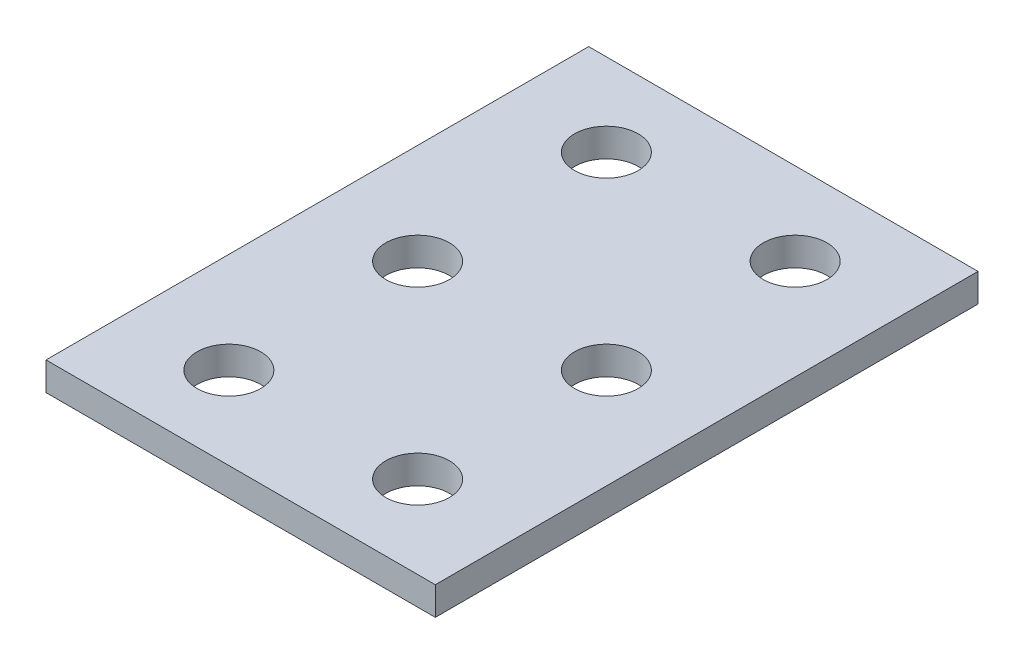
ISO-10303-21;
HEADER;
FILE_DESCRIPTION(('STEP AP214'),'2;1');
FILE_NAME('part.step','',(''),(''),'','','');
FILE_SCHEMA(('AUTOMOTIVE_DESIGN { 1 0 10303 214 1 1 1 1 }'));
ENDSEC;
DATA;
#1=APPLICATION_CONTEXT('core data for automotive mechanical design processes');
#2=APPLICATION_PROTOCOL_DEFINITION('international standard','automotive_design',2000,#1);
#3=PRODUCT_CONTEXT('',#1,'mechanical');
#4=PRODUCT('Part','Part','',(#3));
#5=PRODUCT_RELATED_PRODUCT_CATEGORY('part','',(#4));
#6=PRODUCT_DEFINITION_FORMATION('','',#4);
#7=PRODUCT_DEFINITION_CONTEXT('part definition',#1,'design');
#8=PRODUCT_DEFINITION('design','',#6,#7);
#9=PRODUCT_DEFINITION_SHAPE('','',#8);
#10=(LENGTH_UNIT() NAMED_UNIT(*) SI_UNIT(.MILLI.,.METRE.));
#11=(NAMED_UNIT(*) PLANE_ANGLE_UNIT() SI_UNIT($,.RADIAN.));
#12=(NAMED_UNIT(*) SI_UNIT($,.STERADIAN.) SOLID_ANGLE_UNIT());
#13=UNCERTAINTY_MEASURE_WITH_UNIT(LENGTH_MEASURE(1.E-05),#10,'distance_accuracy_value','');
#14=(GEOMETRIC_REPRESENTATION_CONTEXT(3) GLOBAL_UNCERTAINTY_ASSIGNED_CONTEXT((#13)) GLOBAL_UNIT_ASSIGNED_CONTEXT((#10,
#11,#12)) REPRESENTATION_CONTEXT('',''));
#15=CARTESIAN_POINT('',(0.,0.,0.));
#16=DIRECTION('',(0.,0.,1.));
#17=DIRECTION('',(1.,0.,0.));
#18=AXIS2_PLACEMENT_3D('',#15,#16,#17);
#19=CARTESIAN_POINT('',(0.,12.,0.));
#20=DIRECTION('',(1.,0.,0.));
#21=DIRECTION('',(0.,0.,-1.));
#22=AXIS2_PLACEMENT_3D('',#19,#20,#21);
#23=PLANE('',#22);
#24=DIRECTION('',(0.,0.,1.));
#25=VECTOR('',#24,1.);
#26=CARTESIAN_POINT('',(0.,0.,0.));
#27=LINE('',#26,#25);
#28=CARTESIAN_POINT('',(0.,0.,-230.));
#29=VERTEX_POINT('',#28);
#30=CARTESIAN_POINT('',(0.,0.,0.));
#31=VERTEX_POINT('',#30);
#32=EDGE_CURVE('E97',#29,#31,#27,.T.);
#33=ORIENTED_EDGE('',*,*,#32,.T.);
#34=DIRECTION('',(0.,-1.,0.));
#35=VECTOR('',#34,1.);
#36=CARTESIAN_POINT('',(0.,12.,0.));
#37=LINE('',#36,#35);
#38=CARTESIAN_POINT('',(0.,12.,0.));
#39=VERTEX_POINT('',#38);
#40=EDGE_CURVE('E11',#39,#31,#37,.T.);
#41=ORIENTED_EDGE('',*,*,#40,.F.);
#42=DIRECTION('',(0.,0.,1.));
#43=VECTOR('',#42,1.);
#44=CARTESIAN_POINT('',(0.,12.,0.));
#45=LINE('',#44,#43);
#46=CARTESIAN_POINT('',(0.,12.,-230.));
#47=VERTEX_POINT('',#46);
#48=EDGE_CURVE('E85',#47,#39,#45,.T.);
#49=ORIENTED_EDGE('',*,*,#48,.F.);
#50=DIRECTION('',(0.,-1.,0.));
#51=VECTOR('',#50,1.);
#52=CARTESIAN_POINT('',(0.,12.,-230.));
#53=LINE('',#52,#51);
#54=EDGE_CURVE('E93',#47,#29,#53,.T.);
#55=ORIENTED_EDGE('',*,*,#54,.T.);
#56=EDGE_LOOP('',(#33,#41,#49,#55));
#57=FACE_BOUND('',#56,.T.);
#58=ADVANCED_FACE('F34',(#57),#23,.F.);
#59=CARTESIAN_POINT('',(0.,12.,0.));
#60=DIRECTION('',(0.,0.,-1.));
#61=DIRECTION('',(-1.,0.,0.));
#62=AXIS2_PLACEMENT_3D('',#59,#60,#61);
#63=PLANE('',#62);
#64=DIRECTION('',(1.,0.,0.));
#65=VECTOR('',#64,1.);
#66=CARTESIAN_POINT('',(0.,0.,0.));
#67=LINE('',#66,#65);
#68=CARTESIAN_POINT('',(165.,0.,0.));
#69=VERTEX_POINT('',#68);
#70=EDGE_CURVE('E89',#31,#69,#67,.T.);
#71=ORIENTED_EDGE('',*,*,#70,.T.);
#72=DIRECTION('',(0.,-1.,0.));
#73=VECTOR('',#72,1.);
#74=CARTESIAN_POINT('',(165.,12.,0.));
#75=LINE('',#74,#73);
#76=CARTESIAN_POINT('',(165.,12.,0.));
#77=VERTEX_POINT('',#76);
#78=EDGE_CURVE('E42',#77,#69,#75,.T.);
#79=ORIENTED_EDGE('',*,*,#78,.F.);
#80=DIRECTION('',(1.,0.,0.));
#81=VECTOR('',#80,1.);
#82=CARTESIAN_POINT('',(0.,12.,0.));
#83=LINE('',#82,#81);
#84=EDGE_CURVE('E80',#39,#77,#83,.T.);
#85=ORIENTED_EDGE('',*,*,#84,.F.);
#86=ORIENTED_EDGE('',*,*,#40,.T.);
#87=EDGE_LOOP('',(#71,#79,#85,#86));
#88=FACE_BOUND('',#87,.T.);
#89=ADVANCED_FACE('F88',(#88),#63,.F.);
#90=CARTESIAN_POINT('',(165.,12.,0.));
#91=DIRECTION('',(-1.,0.,0.));
#92=DIRECTION('',(0.,0.,1.));
#93=AXIS2_PLACEMENT_3D('',#90,#91,#92);
#94=PLANE('',#93);
#95=DIRECTION('',(0.,0.,-1.));
#96=VECTOR('',#95,1.);
#97=CARTESIAN_POINT('',(165.,0.,0.));
#98=LINE('',#97,#96);
#99=CARTESIAN_POINT('',(165.,0.,-230.));
#100=VERTEX_POINT('',#99);
#101=EDGE_CURVE('E67',#69,#100,#98,.T.);
#102=ORIENTED_EDGE('',*,*,#101,.T.);
#103=DIRECTION('',(0.,-1.,0.));
#104=VECTOR('',#103,1.);
#105=CARTESIAN_POINT('',(165.,12.,-230.));
#106=LINE('',#105,#104);
#107=CARTESIAN_POINT('',(165.,12.,-230.));
#108=VERTEX_POINT('',#107);
#109=EDGE_CURVE('E90',#108,#100,#106,.T.);
#110=ORIENTED_EDGE('',*,*,#109,.F.);
#111=DIRECTION('',(0.,0.,-1.));
#112=VECTOR('',#111,1.);
#113=CARTESIAN_POINT('',(165.,12.,0.));
#114=LINE('',#113,#112);
#115=EDGE_CURVE('E83',#77,#108,#114,.T.);
#116=ORIENTED_EDGE('',*,*,#115,.F.);
#117=ORIENTED_EDGE('',*,*,#78,.T.);
#118=EDGE_LOOP('',(#102,#110,#116,#117));
#119=FACE_BOUND('',#118,.T.);
#120=ADVANCED_FACE('F91',(#119),#94,.F.);
#121=CARTESIAN_POINT('',(0.,12.,-230.));
#122=DIRECTION('',(0.,0.,1.));
#123=DIRECTION('',(1.,0.,0.));
#124=AXIS2_PLACEMENT_3D('',#121,#122,#123);
#125=PLANE('',#124);
#126=DIRECTION('',(-1.,0.,0.));
#127=VECTOR('',#126,1.);
#128=CARTESIAN_POINT('',(0.,0.,-230.));
#129=LINE('',#128,#127);
#130=EDGE_CURVE('E73',#100,#29,#129,.T.);
#131=ORIENTED_EDGE('',*,*,#130,.T.);
#132=ORIENTED_EDGE('',*,*,#54,.F.);
#133=DIRECTION('',(-1.,0.,0.));
#134=VECTOR('',#133,1.);
#135=CARTESIAN_POINT('',(0.,12.,-230.));
#136=LINE('',#135,#134);
#137=EDGE_CURVE('E50',#108,#47,#136,.T.);
#138=ORIENTED_EDGE('',*,*,#137,.F.);
#139=ORIENTED_EDGE('',*,*,#109,.T.);
#140=EDGE_LOOP('',(#131,#132,#138,#139));
#141=FACE_BOUND('',#140,.T.);
#142=ADVANCED_FACE('F105',(#141),#125,.F.);
#143=CARTESIAN_POINT('',(0.,12.,0.));
#144=DIRECTION('',(0.,-1.,0.));
#145=DIRECTION('',(0.,0.,-1.));
#146=AXIS2_PLACEMENT_3D('',#143,#144,#145);
#147=PLANE('',#146);
#148=CARTESIAN_POINT('',(122.500000000001,12.,-34.9999999999983));
#149=DIRECTION('',(0.,1.,0.));
#150=DIRECTION('',(0.,0.,1.));
#151=AXIS2_PLACEMENT_3D('',#148,#149,#150);
#152=CIRCLE('',#151,13.5);
#153=CARTESIAN_POINT('',(122.500000000001,12.,-21.4999999999983));
#154=VERTEX_POINT('',#153);
#155=EDGE_CURVE('E141',#154,#154,#152,.T.);
#156=ORIENTED_EDGE('',*,*,#155,.F.);
#157=EDGE_LOOP('',(#156));
#158=FACE_BOUND('',#157,.T.);
#159=CARTESIAN_POINT('',(42.4999999999949,12.,-34.9999999999983));
#160=DIRECTION('',(0.,1.,0.));
#161=DIRECTION('',(0.,0.,1.));
#162=AXIS2_PLACEMENT_3D('',#159,#160,#161);
#163=CIRCLE('',#162,13.5);
#164=CARTESIAN_POINT('',(42.4999999999949,12.,-21.4999999999983));
#165=VERTEX_POINT('',#164);
#166=EDGE_CURVE('E135',#165,#165,#163,.T.);
#167=ORIENTED_EDGE('',*,*,#166,.F.);
#168=EDGE_LOOP('',(#167));
#169=FACE_BOUND('',#168,.T.);
#170=CARTESIAN_POINT('',(122.500000000001,12.,-115.000000000005));
#171=DIRECTION('',(0.,1.,0.));
#172=DIRECTION('',(0.,0.,1.));
#173=AXIS2_PLACEMENT_3D('',#170,#171,#172);
#174=CIRCLE('',#173,13.5);
#175=CARTESIAN_POINT('',(122.500000000001,12.,-101.500000000005));
#176=VERTEX_POINT('',#175);
#177=EDGE_CURVE('E129',#176,#176,#174,.T.);
#178=ORIENTED_EDGE('',*,*,#177,.F.);
#179=EDGE_LOOP('',(#178));
#180=FACE_BOUND('',#179,.T.);
#181=CARTESIAN_POINT('',(42.4999999999949,12.,-115.000000000005));
#182=DIRECTION('',(0.,1.,0.));
#183=DIRECTION('',(0.,0.,1.));
#184=AXIS2_PLACEMENT_3D('',#181,#182,#183);
#185=CIRCLE('',#184,13.5);
#186=CARTESIAN_POINT('',(42.4999999999949,12.,-101.500000000005));
#187=VERTEX_POINT('',#186);
#188=EDGE_CURVE('E123',#187,#187,#185,.T.);
#189=ORIENTED_EDGE('',*,*,#188,.F.);
#190=EDGE_LOOP('',(#189));
#191=FACE_BOUND('',#190,.T.);
#192=CARTESIAN_POINT('',(122.500000000001,12.,-194.999999999997));
#193=DIRECTION('',(0.,1.,0.));
#194=DIRECTION('',(0.,0.,1.));
#195=AXIS2_PLACEMENT_3D('',#192,#193,#194);
#196=CIRCLE('',#195,13.5);
#197=CARTESIAN_POINT('',(122.500000000001,12.,-181.499999999997));
#198=VERTEX_POINT('',#197);
#199=EDGE_CURVE('E117',#198,#198,#196,.T.);
#200=ORIENTED_EDGE('',*,*,#199,.F.);
#201=EDGE_LOOP('',(#200));
#202=FACE_BOUND('',#201,.T.);
#203=CARTESIAN_POINT('',(42.5,12.,-195.));
#204=DIRECTION('',(0.,1.,0.));
#205=DIRECTION('',(0.,0.,1.));
#206=AXIS2_PLACEMENT_3D('',#203,#204,#205);
#207=CIRCLE('',#206,13.5);
#208=CARTESIAN_POINT('',(42.5,12.,-181.5));
#209=VERTEX_POINT('',#208);
#210=EDGE_CURVE('E111',#209,#209,#207,.T.);
#211=ORIENTED_EDGE('',*,*,#210,.F.);
#212=EDGE_LOOP('',(#211));
#213=FACE_BOUND('',#212,.T.);
#214=ORIENTED_EDGE('',*,*,#48,.T.);
#215=ORIENTED_EDGE('',*,*,#84,.T.);
#216=ORIENTED_EDGE('',*,*,#115,.T.);
#217=ORIENTED_EDGE('',*,*,#137,.T.);
#218=EDGE_LOOP('',(#214,#215,#216,#217));
#219=FACE_BOUND('',#218,.T.);
#220=ADVANCED_FACE('F81',(#158,#169,#180,#191,#202,#213,#219),#147,.F.);
#221=CARTESIAN_POINT('',(0.,0.,0.));
#222=DIRECTION('',(0.,-1.,0.));
#223=DIRECTION('',(0.,0.,-1.));
#224=AXIS2_PLACEMENT_3D('',#221,#222,#223);
#225=PLANE('',#224);
#226=CARTESIAN_POINT('',(122.500000000001,0.,-34.9999999999983));
#227=DIRECTION('',(0.,1.,0.));
#228=DIRECTION('',(0.,0.,1.));
#229=AXIS2_PLACEMENT_3D('',#226,#227,#228);
#230=CIRCLE('',#229,13.5);
#231=CARTESIAN_POINT('',(122.500000000001,0.,-21.4999999999983));
#232=VERTEX_POINT('',#231);
#233=EDGE_CURVE('E138',#232,#232,#230,.T.);
#234=ORIENTED_EDGE('',*,*,#233,.T.);
#235=EDGE_LOOP('',(#234));
#236=FACE_BOUND('',#235,.T.);
#237=CARTESIAN_POINT('',(42.4999999999949,0.,-34.9999999999983));
#238=DIRECTION('',(0.,1.,0.));
#239=DIRECTION('',(0.,0.,1.));
#240=AXIS2_PLACEMENT_3D('',#237,#238,#239);
#241=CIRCLE('',#240,13.5);
#242=CARTESIAN_POINT('',(42.4999999999949,0.,-21.4999999999983));
#243=VERTEX_POINT('',#242);
#244=EDGE_CURVE('E132',#243,#243,#241,.T.);
#245=ORIENTED_EDGE('',*,*,#244,.T.);
#246=EDGE_LOOP('',(#245));
#247=FACE_BOUND('',#246,.T.);
#248=CARTESIAN_POINT('',(122.500000000001,0.,-115.000000000005));
#249=DIRECTION('',(0.,1.,0.));
#250=DIRECTION('',(0.,0.,1.));
#251=AXIS2_PLACEMENT_3D('',#248,#249,#250);
#252=CIRCLE('',#251,13.5);
#253=CARTESIAN_POINT('',(122.500000000001,0.,-101.500000000005));
#254=VERTEX_POINT('',#253);
#255=EDGE_CURVE('E126',#254,#254,#252,.T.);
#256=ORIENTED_EDGE('',*,*,#255,.T.);
#257=EDGE_LOOP('',(#256));
#258=FACE_BOUND('',#257,.T.);
#259=CARTESIAN_POINT('',(42.4999999999949,0.,-115.000000000005));
#260=DIRECTION('',(0.,1.,0.));
#261=DIRECTION('',(0.,0.,1.));
#262=AXIS2_PLACEMENT_3D('',#259,#260,#261);
#263=CIRCLE('',#262,13.5);
#264=CARTESIAN_POINT('',(42.4999999999949,0.,-101.500000000005));
#265=VERTEX_POINT('',#264);
#266=EDGE_CURVE('E120',#265,#265,#263,.T.);
#267=ORIENTED_EDGE('',*,*,#266,.T.);
#268=EDGE_LOOP('',(#267));
#269=FACE_BOUND('',#268,.T.);
#270=CARTESIAN_POINT('',(122.500000000001,0.,-194.999999999997));
#271=DIRECTION('',(0.,1.,0.));
#272=DIRECTION('',(0.,0.,1.));
#273=AXIS2_PLACEMENT_3D('',#270,#271,#272);
#274=CIRCLE('',#273,13.5);
#275=CARTESIAN_POINT('',(122.500000000001,0.,-181.499999999997));
#276=VERTEX_POINT('',#275);
#277=EDGE_CURVE('E114',#276,#276,#274,.T.);
#278=ORIENTED_EDGE('',*,*,#277,.T.);
#279=EDGE_LOOP('',(#278));
#280=FACE_BOUND('',#279,.T.);
#281=CARTESIAN_POINT('',(42.5,0.,-195.));
#282=DIRECTION('',(0.,1.,0.));
#283=DIRECTION('',(0.,0.,1.));
#284=AXIS2_PLACEMENT_3D('',#281,#282,#283);
#285=CIRCLE('',#284,13.5);
#286=CARTESIAN_POINT('',(42.5,0.,-181.5));
#287=VERTEX_POINT('',#286);
#288=EDGE_CURVE('E100',#287,#287,#285,.T.);
#289=ORIENTED_EDGE('',*,*,#288,.T.);
#290=EDGE_LOOP('',(#289));
#291=FACE_BOUND('',#290,.T.);
#292=ORIENTED_EDGE('',*,*,#32,.F.);
#293=ORIENTED_EDGE('',*,*,#130,.F.);
#294=ORIENTED_EDGE('',*,*,#101,.F.);
#295=ORIENTED_EDGE('',*,*,#70,.F.);
#296=EDGE_LOOP('',(#292,#293,#294,#295));
#297=FACE_BOUND('',#296,.T.);
#298=ADVANCED_FACE('F108',(#236,#247,#258,#269,#280,#291,#297),#225,.T.);
#299=CARTESIAN_POINT('',(42.5,0.,-195.));
#300=DIRECTION('',(0.,1.,0.));
#301=DIRECTION('',(0.,0.,1.));
#302=AXIS2_PLACEMENT_3D('',#299,#300,#301);
#303=CYLINDRICAL_SURFACE('',#302,13.5);
#304=ORIENTED_EDGE('',*,*,#288,.F.);
#305=EDGE_LOOP('',(#304));
#306=FACE_BOUND('',#305,.T.);
#307=ORIENTED_EDGE('',*,*,#210,.T.);
#308=EDGE_LOOP('',(#307));
#309=FACE_BOUND('',#308,.T.);
#310=ADVANCED_FACE('F169',(#306,#309),#303,.F.);
#311=CARTESIAN_POINT('',(122.500000000001,0.,-194.999999999997));
#312=DIRECTION('',(0.,1.,0.));
#313=DIRECTION('',(0.,0.,1.));
#314=AXIS2_PLACEMENT_3D('',#311,#312,#313);
#315=CYLINDRICAL_SURFACE('',#314,13.5);
#316=ORIENTED_EDGE('',*,*,#277,.F.);
#317=EDGE_LOOP('',(#316));
#318=FACE_BOUND('',#317,.T.);
#319=ORIENTED_EDGE('',*,*,#199,.T.);
#320=EDGE_LOOP('',(#319));
#321=FACE_BOUND('',#320,.T.);
#322=ADVANCED_FACE('F171',(#318,#321),#315,.F.);
#323=CARTESIAN_POINT('',(42.4999999999949,0.,-115.000000000005));
#324=DIRECTION('',(0.,1.,0.));
#325=DIRECTION('',(0.,0.,1.));
#326=AXIS2_PLACEMENT_3D('',#323,#324,#325);
#327=CYLINDRICAL_SURFACE('',#326,13.5);
#328=ORIENTED_EDGE('',*,*,#266,.F.);
#329=EDGE_LOOP('',(#328));
#330=FACE_BOUND('',#329,.T.);
#331=ORIENTED_EDGE('',*,*,#188,.T.);
#332=EDGE_LOOP('',(#331));
#333=FACE_BOUND('',#332,.T.);
#334=ADVANCED_FACE('F178',(#330,#333),#327,.F.);
#335=CARTESIAN_POINT('',(122.500000000001,0.,-115.000000000005));
#336=DIRECTION('',(0.,1.,0.));
#337=DIRECTION('',(0.,0.,1.));
#338=AXIS2_PLACEMENT_3D('',#335,#336,#337);
#339=CYLINDRICAL_SURFACE('',#338,13.5);
#340=ORIENTED_EDGE('',*,*,#255,.F.);
#341=EDGE_LOOP('',(#340));
#342=FACE_BOUND('',#341,.T.);
#343=ORIENTED_EDGE('',*,*,#177,.T.);
#344=EDGE_LOOP('',(#343));
#345=FACE_BOUND('',#344,.T.);
#346=ADVANCED_FACE('F224',(#342,#345),#339,.F.);
#347=CARTESIAN_POINT('',(42.4999999999949,0.,-34.9999999999983));
#348=DIRECTION('',(0.,1.,0.));
#349=DIRECTION('',(0.,0.,1.));
#350=AXIS2_PLACEMENT_3D('',#347,#348,#349);
#351=CYLINDRICAL_SURFACE('',#350,13.5);
#352=ORIENTED_EDGE('',*,*,#244,.F.);
#353=EDGE_LOOP('',(#352));
#354=FACE_BOUND('',#353,.T.);
#355=ORIENTED_EDGE('',*,*,#166,.T.);
#356=EDGE_LOOP('',(#355));
#357=FACE_BOUND('',#356,.T.);
#358=ADVANCED_FACE('F152',(#354,#357),#351,.F.);
#359=CARTESIAN_POINT('',(122.500000000001,0.,-34.9999999999983));
#360=DIRECTION('',(0.,1.,0.));
#361=DIRECTION('',(0.,0.,1.));
#362=AXIS2_PLACEMENT_3D('',#359,#360,#361);
#363=CYLINDRICAL_SURFACE('',#362,13.5);
#364=ORIENTED_EDGE('',*,*,#233,.F.);
#365=EDGE_LOOP('',(#364));
#366=FACE_BOUND('',#365,.T.);
#367=ORIENTED_EDGE('',*,*,#155,.T.);
#368=EDGE_LOOP('',(#367));
#369=FACE_BOUND('',#368,.T.);
#370=ADVANCED_FACE('F149',(#366,#369),#363,.F.);
#371=CLOSED_SHELL('',(#58,#89,#120,#142,#220,#298,#310,#322,#334,#346,#358,#370));
#372=MANIFOLD_SOLID_BREP('B2',#371);
#373=ADVANCED_BREP_SHAPE_REPRESENTATION('',(#18,#372),#14);
#374=SHAPE_DEFINITION_REPRESENTATION(#9,#373);
ENDSEC;
END-ISO-10303-21;
